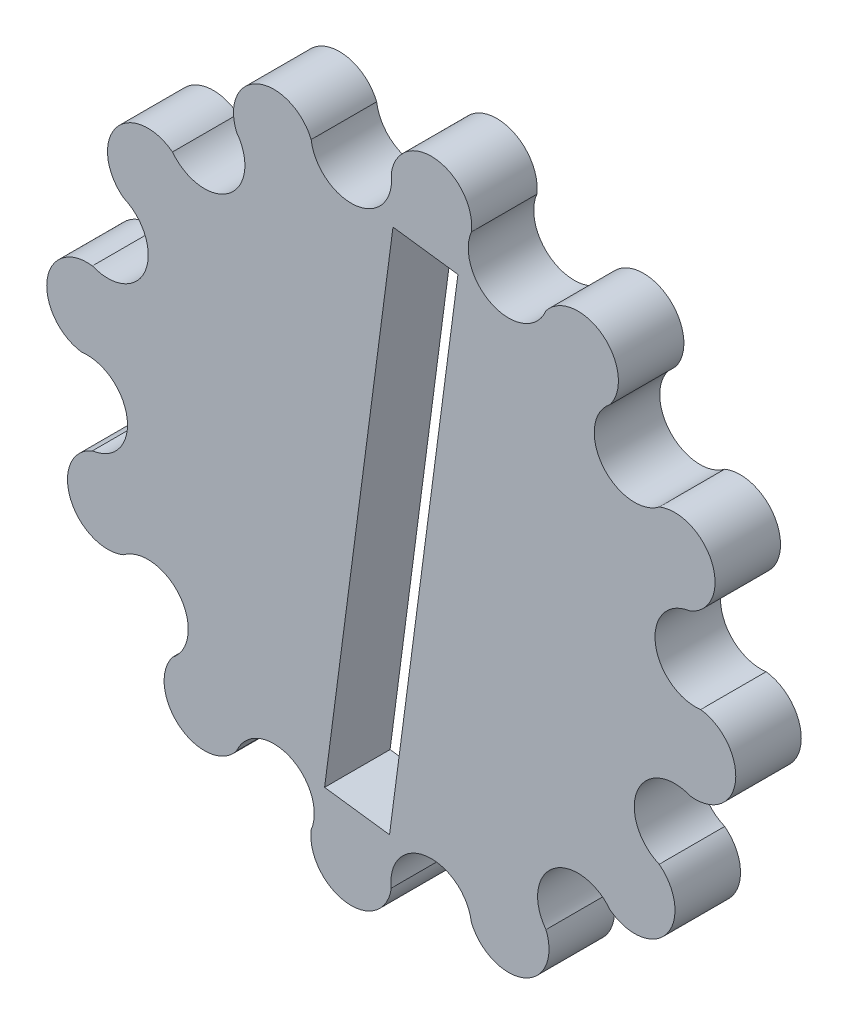
ISO-10303-21;
HEADER;
FILE_DESCRIPTION(('STEP AP214'),'2;1');
FILE_NAME('part.step','',(''),(''),'','','');
FILE_SCHEMA(('AUTOMOTIVE_DESIGN { 1 0 10303 214 1 1 1 1 }'));
ENDSEC;
DATA;
#1=APPLICATION_CONTEXT('core data for automotive mechanical design processes');
#2=APPLICATION_PROTOCOL_DEFINITION('international standard','automotive_design',2000,#1);
#3=PRODUCT_CONTEXT('',#1,'mechanical');
#4=PRODUCT('Part','Part','',(#3));
#5=PRODUCT_RELATED_PRODUCT_CATEGORY('part','',(#4));
#6=PRODUCT_DEFINITION_FORMATION('','',#4);
#7=PRODUCT_DEFINITION_CONTEXT('part definition',#1,'design');
#8=PRODUCT_DEFINITION('design','',#6,#7);
#9=PRODUCT_DEFINITION_SHAPE('','',#8);
#10=(LENGTH_UNIT() NAMED_UNIT(*) SI_UNIT(.MILLI.,.METRE.));
#11=(NAMED_UNIT(*) PLANE_ANGLE_UNIT() SI_UNIT($,.RADIAN.));
#12=(NAMED_UNIT(*) SI_UNIT($,.STERADIAN.) SOLID_ANGLE_UNIT());
#13=UNCERTAINTY_MEASURE_WITH_UNIT(LENGTH_MEASURE(1.E-05),#10,'distance_accuracy_value','');
#14=(GEOMETRIC_REPRESENTATION_CONTEXT(3) GLOBAL_UNCERTAINTY_ASSIGNED_CONTEXT((#13)) GLOBAL_UNIT_ASSIGNED_CONTEXT((#10,
#11,#12)) REPRESENTATION_CONTEXT('',''));
#15=CARTESIAN_POINT('',(0.,0.,0.));
#16=DIRECTION('',(0.,0.,1.));
#17=DIRECTION('',(1.,0.,0.));
#18=AXIS2_PLACEMENT_3D('',#15,#16,#17);
#19=CARTESIAN_POINT('',(-1.94114283826902,14.744443697168,3.175));
#20=DIRECTION('',(0.,0.,-1.));
#21=DIRECTION('',(-1.,0.,0.));
#22=AXIS2_PLACEMENT_3D('',#19,#20,#21);
#23=CYLINDRICAL_SURFACE('',#22,1.95789288330086);
#24=CARTESIAN_POINT('',(-1.94114283826902,14.744443697168,0.));
#25=DIRECTION('',(0.,0.,1.));
#26=DIRECTION('',(1.,0.,0.));
#27=AXIS2_PLACEMENT_3D('',#24,#25,#26);
#28=CIRCLE('',#27,1.95789288330086);
#29=CARTESIAN_POINT('',(-3.88228567653787,14.4888873943363,0.));
#30=VERTEX_POINT('',#29);
#31=CARTESIAN_POINT('',(0.,15.,0.));
#32=VERTEX_POINT('',#31);
#33=EDGE_CURVE('E250',#30,#32,#28,.T.);
#34=ORIENTED_EDGE('',*,*,#33,.F.);
#35=DIRECTION('',(0.,0.,-1.));
#36=VECTOR('',#35,1.);
#37=CARTESIAN_POINT('',(-3.88228567653787,14.4888873943363,3.175));
#38=LINE('',#37,#36);
#39=CARTESIAN_POINT('',(-3.88228567653787,14.4888873943363,3.175));
#40=VERTEX_POINT('',#39);
#41=EDGE_CURVE('E11',#40,#30,#38,.T.);
#42=ORIENTED_EDGE('',*,*,#41,.F.);
#43=CARTESIAN_POINT('',(-1.94114283826902,14.744443697168,3.175));
#44=DIRECTION('',(0.,0.,1.));
#45=DIRECTION('',(1.,0.,0.));
#46=AXIS2_PLACEMENT_3D('',#43,#44,#45);
#47=CIRCLE('',#46,1.95789288330086);
#48=CARTESIAN_POINT('',(0.,15.,3.175));
#49=VERTEX_POINT('',#48);
#50=EDGE_CURVE('E254',#40,#49,#47,.T.);
#51=ORIENTED_EDGE('',*,*,#50,.T.);
#52=DIRECTION('',(0.,0.,-1.));
#53=VECTOR('',#52,1.);
#54=CARTESIAN_POINT('',(0.,15.,3.175));
#55=LINE('',#54,#53);
#56=EDGE_CURVE('E327',#49,#32,#55,.T.);
#57=ORIENTED_EDGE('',*,*,#56,.T.);
#58=EDGE_LOOP('',(#34,#42,#51,#57));
#59=FACE_BOUND('',#58,.T.);
#60=ADVANCED_FACE('F36',(#59),#23,.F.);
#61=CARTESIAN_POINT('',(-5.69114283826919,13.7396342255516,3.175));
#62=DIRECTION('',(0.,0.,-1.));
#63=DIRECTION('',(-1.,0.,0.));
#64=AXIS2_PLACEMENT_3D('',#61,#62,#63);
#65=CYLINDRICAL_SURFACE('',#64,1.95789288330097);
#66=CARTESIAN_POINT('',(-5.69114283826919,13.7396342255516,0.));
#67=DIRECTION('',(0.,0.,1.));
#68=DIRECTION('',(1.,0.,0.));
#69=AXIS2_PLACEMENT_3D('',#66,#67,#68);
#70=CIRCLE('',#69,1.95789288330097);
#71=CARTESIAN_POINT('',(-7.50000000000024,12.9903810567662,0.));
#72=VERTEX_POINT('',#71);
#73=EDGE_CURVE('E330',#72,#30,#70,.F.);
#74=ORIENTED_EDGE('',*,*,#73,.F.);
#75=DIRECTION('',(0.,0.,-1.));
#76=VECTOR('',#75,1.);
#77=CARTESIAN_POINT('',(-7.50000000000024,12.9903810567662,3.175));
#78=LINE('',#77,#76);
#79=CARTESIAN_POINT('',(-7.50000000000024,12.9903810567662,3.175));
#80=VERTEX_POINT('',#79);
#81=EDGE_CURVE('E43',#80,#72,#78,.T.);
#82=ORIENTED_EDGE('',*,*,#81,.F.);
#83=CARTESIAN_POINT('',(-5.69114283826919,13.7396342255516,3.175));
#84=DIRECTION('',(0.,0.,1.));
#85=DIRECTION('',(1.,0.,0.));
#86=AXIS2_PLACEMENT_3D('',#83,#84,#85);
#87=CIRCLE('',#86,1.95789288330097);
#88=EDGE_CURVE('E257',#80,#40,#87,.F.);
#89=ORIENTED_EDGE('',*,*,#88,.T.);
#90=ORIENTED_EDGE('',*,*,#41,.T.);
#91=EDGE_LOOP('',(#74,#82,#89,#90));
#92=FACE_BOUND('',#91,.T.);
#93=ADVANCED_FACE('F447',(#92),#65,.T.);
#94=CARTESIAN_POINT('',(-9.0533008588994,11.7984913872822,3.175));
#95=DIRECTION('',(0.,0.,-1.));
#96=DIRECTION('',(-1.,0.,0.));
#97=AXIS2_PLACEMENT_3D('',#94,#95,#96);
#98=CYLINDRICAL_SURFACE('',#97,1.95789288330074);
#99=CARTESIAN_POINT('',(-9.0533008588994,11.7984913872822,0.));
#100=DIRECTION('',(0.,0.,1.));
#101=DIRECTION('',(1.,0.,0.));
#102=AXIS2_PLACEMENT_3D('',#99,#100,#101);
#103=CIRCLE('',#102,1.95789288330074);
#104=CARTESIAN_POINT('',(-10.6066017177988,10.6066017177981,0.));
#105=VERTEX_POINT('',#104);
#106=EDGE_CURVE('E333',#105,#72,#103,.T.);
#107=ORIENTED_EDGE('',*,*,#106,.F.);
#108=DIRECTION('',(0.,0.,-1.));
#109=VECTOR('',#108,1.);
#110=CARTESIAN_POINT('',(-10.6066017177988,10.6066017177981,3.175));
#111=LINE('',#110,#109);
#112=CARTESIAN_POINT('',(-10.6066017177988,10.6066017177981,3.175));
#113=VERTEX_POINT('',#112);
#114=EDGE_CURVE('E439',#113,#105,#111,.T.);
#115=ORIENTED_EDGE('',*,*,#114,.F.);
#116=CARTESIAN_POINT('',(-9.0533008588994,11.7984913872822,3.175));
#117=DIRECTION('',(0.,0.,1.));
#118=DIRECTION('',(1.,0.,0.));
#119=AXIS2_PLACEMENT_3D('',#116,#117,#118);
#120=CIRCLE('',#119,1.95789288330074);
#121=EDGE_CURVE('E261',#113,#80,#120,.T.);
#122=ORIENTED_EDGE('',*,*,#121,.T.);
#123=ORIENTED_EDGE('',*,*,#81,.T.);
#124=EDGE_LOOP('',(#107,#115,#122,#123));
#125=FACE_BOUND('',#124,.T.);
#126=ADVANCED_FACE('F443',(#125),#98,.F.);
#127=CARTESIAN_POINT('',(-11.7984913872827,9.05330085889871,3.175));
#128=DIRECTION('',(0.,0.,-1.));
#129=DIRECTION('',(-1.,0.,0.));
#130=AXIS2_PLACEMENT_3D('',#127,#128,#129);
#131=CYLINDRICAL_SURFACE('',#130,1.95789288330083);
#132=CARTESIAN_POINT('',(-11.7984913872827,9.05330085889871,0.));
#133=DIRECTION('',(0.,0.,1.));
#134=DIRECTION('',(1.,0.,0.));
#135=AXIS2_PLACEMENT_3D('',#132,#133,#134);
#136=CIRCLE('',#135,1.95789288330083);
#137=CARTESIAN_POINT('',(-12.9903810567669,7.49999999999959,0.));
#138=VERTEX_POINT('',#137);
#139=EDGE_CURVE('E336',#138,#105,#136,.F.);
#140=ORIENTED_EDGE('',*,*,#139,.F.);
#141=DIRECTION('',(0.,0.,-1.));
#142=VECTOR('',#141,1.);
#143=CARTESIAN_POINT('',(-12.9903810567669,7.49999999999959,3.175));
#144=LINE('',#143,#142);
#145=CARTESIAN_POINT('',(-12.9903810567669,7.49999999999959,3.175));
#146=VERTEX_POINT('',#145);
#147=EDGE_CURVE('E437',#146,#138,#144,.T.);
#148=ORIENTED_EDGE('',*,*,#147,.F.);
#149=CARTESIAN_POINT('',(-11.7984913872827,9.05330085889871,3.175));
#150=DIRECTION('',(0.,0.,1.));
#151=DIRECTION('',(1.,0.,0.));
#152=AXIS2_PLACEMENT_3D('',#149,#150,#151);
#153=CIRCLE('',#152,1.95789288330083);
#154=EDGE_CURVE('E264',#146,#113,#153,.F.);
#155=ORIENTED_EDGE('',*,*,#154,.T.);
#156=ORIENTED_EDGE('',*,*,#114,.T.);
#157=EDGE_LOOP('',(#140,#148,#155,#156));
#158=FACE_BOUND('',#157,.T.);
#159=ADVANCED_FACE('F454',(#158),#131,.T.);
#160=CARTESIAN_POINT('',(-13.7396342255516,5.69114283826829,3.175));
#161=DIRECTION('',(0.,0.,-1.));
#162=DIRECTION('',(-1.,0.,0.));
#163=AXIS2_PLACEMENT_3D('',#160,#161,#162);
#164=CYLINDRICAL_SURFACE('',#163,1.95789288330093);
#165=CARTESIAN_POINT('',(-13.7396342255516,5.69114283826829,0.));
#166=DIRECTION('',(0.,0.,1.));
#167=DIRECTION('',(1.,0.,0.));
#168=AXIS2_PLACEMENT_3D('',#165,#166,#167);
#169=CIRCLE('',#168,1.95789288330093);
#170=CARTESIAN_POINT('',(-14.4888873943364,3.88228567653716,0.));
#171=VERTEX_POINT('',#170);
#172=EDGE_CURVE('E339',#171,#138,#169,.T.);
#173=ORIENTED_EDGE('',*,*,#172,.F.);
#174=DIRECTION('',(0.,0.,-1.));
#175=VECTOR('',#174,1.);
#176=CARTESIAN_POINT('',(-14.4888873943364,3.88228567653716,3.175));
#177=LINE('',#176,#175);
#178=CARTESIAN_POINT('',(-14.4888873943364,3.88228567653716,3.175));
#179=VERTEX_POINT('',#178);
#180=EDGE_CURVE('E435',#179,#171,#177,.T.);
#181=ORIENTED_EDGE('',*,*,#180,.F.);
#182=CARTESIAN_POINT('',(-13.7396342255516,5.69114283826829,3.175));
#183=DIRECTION('',(0.,0.,1.));
#184=DIRECTION('',(1.,0.,0.));
#185=AXIS2_PLACEMENT_3D('',#182,#183,#184);
#186=CIRCLE('',#185,1.95789288330093);
#187=EDGE_CURVE('E267',#179,#146,#186,.T.);
#188=ORIENTED_EDGE('',*,*,#187,.T.);
#189=ORIENTED_EDGE('',*,*,#147,.T.);
#190=EDGE_LOOP('',(#173,#181,#188,#189));
#191=FACE_BOUND('',#190,.T.);
#192=ADVANCED_FACE('F536',(#191),#164,.F.);
#193=CARTESIAN_POINT('',(-14.7444436971682,1.94114283826815,3.175));
#194=DIRECTION('',(0.,0.,-1.));
#195=DIRECTION('',(-1.,0.,0.));
#196=AXIS2_PLACEMENT_3D('',#193,#194,#195);
#197=CYLINDRICAL_SURFACE('',#196,1.95789288330085);
#198=CARTESIAN_POINT('',(-14.7444436971682,1.94114283826815,0.));
#199=DIRECTION('',(0.,0.,1.));
#200=DIRECTION('',(1.,0.,0.));
#201=AXIS2_PLACEMENT_3D('',#198,#199,#200);
#202=CIRCLE('',#201,1.95789288330085);
#203=CARTESIAN_POINT('',(-15.,-8.5413447148408E-13,0.));
#204=VERTEX_POINT('',#203);
#205=EDGE_CURVE('E342',#204,#171,#202,.F.);
#206=ORIENTED_EDGE('',*,*,#205,.F.);
#207=DIRECTION('',(0.,0.,-1.));
#208=VECTOR('',#207,1.);
#209=CARTESIAN_POINT('',(-15.,-8.5413447148408E-13,3.175));
#210=LINE('',#209,#208);
#211=CARTESIAN_POINT('',(-15.,-8.5413447148408E-13,3.175));
#212=VERTEX_POINT('',#211);
#213=EDGE_CURVE('E433',#212,#204,#210,.T.);
#214=ORIENTED_EDGE('',*,*,#213,.F.);
#215=CARTESIAN_POINT('',(-14.7444436971682,1.94114283826815,3.175));
#216=DIRECTION('',(0.,0.,1.));
#217=DIRECTION('',(1.,0.,0.));
#218=AXIS2_PLACEMENT_3D('',#215,#216,#217);
#219=CIRCLE('',#218,1.95789288330085);
#220=EDGE_CURVE('E270',#212,#179,#219,.F.);
#221=ORIENTED_EDGE('',*,*,#220,.T.);
#222=ORIENTED_EDGE('',*,*,#180,.T.);
#223=EDGE_LOOP('',(#206,#214,#221,#222));
#224=FACE_BOUND('',#223,.T.);
#225=ADVANCED_FACE('F534',(#224),#197,.T.);
#226=CARTESIAN_POINT('',(-14.7444436971681,-1.94114283826985,3.175));
#227=DIRECTION('',(0.,0.,-1.));
#228=DIRECTION('',(-1.,0.,0.));
#229=AXIS2_PLACEMENT_3D('',#226,#227,#228);
#230=CYLINDRICAL_SURFACE('',#229,1.95789288330085);
#231=CARTESIAN_POINT('',(-14.7444436971681,-1.94114283826985,0.));
#232=DIRECTION('',(0.,0.,1.));
#233=DIRECTION('',(1.,0.,0.));
#234=AXIS2_PLACEMENT_3D('',#231,#232,#233);
#235=CIRCLE('',#234,1.95789288330085);
#236=CARTESIAN_POINT('',(-14.4888873943362,-3.88228567653885,0.));
#237=VERTEX_POINT('',#236);
#238=EDGE_CURVE('E345',#237,#204,#235,.T.);
#239=ORIENTED_EDGE('',*,*,#238,.F.);
#240=DIRECTION('',(0.,0.,-1.));
#241=VECTOR('',#240,1.);
#242=CARTESIAN_POINT('',(-14.4888873943362,-3.88228567653885,3.175));
#243=LINE('',#242,#241);
#244=CARTESIAN_POINT('',(-14.4888873943362,-3.88228567653885,3.175));
#245=VERTEX_POINT('',#244);
#246=EDGE_CURVE('E431',#245,#237,#243,.T.);
#247=ORIENTED_EDGE('',*,*,#246,.F.);
#248=CARTESIAN_POINT('',(-14.7444436971681,-1.94114283826985,3.175));
#249=DIRECTION('',(0.,0.,1.));
#250=DIRECTION('',(1.,0.,0.));
#251=AXIS2_PLACEMENT_3D('',#248,#249,#250);
#252=CIRCLE('',#251,1.95789288330085);
#253=EDGE_CURVE('E273',#245,#212,#252,.T.);
#254=ORIENTED_EDGE('',*,*,#253,.T.);
#255=ORIENTED_EDGE('',*,*,#213,.T.);
#256=EDGE_LOOP('',(#239,#247,#254,#255));
#257=FACE_BOUND('',#256,.T.);
#258=ADVANCED_FACE('F530',(#257),#230,.F.);
#259=CARTESIAN_POINT('',(-13.7396342255513,-5.69114283826993,3.175));
#260=DIRECTION('',(0.,0.,-1.));
#261=DIRECTION('',(-1.,0.,0.));
#262=AXIS2_PLACEMENT_3D('',#259,#260,#261);
#263=CYLINDRICAL_SURFACE('',#262,1.95789288330085);
#264=CARTESIAN_POINT('',(-13.7396342255513,-5.69114283826993,0.));
#265=DIRECTION('',(0.,0.,1.));
#266=DIRECTION('',(1.,0.,0.));
#267=AXIS2_PLACEMENT_3D('',#264,#265,#266);
#268=CIRCLE('',#267,1.95789288330085);
#269=CARTESIAN_POINT('',(-12.9903810567663,-7.50000000000101,0.));
#270=VERTEX_POINT('',#269);
#271=EDGE_CURVE('E348',#270,#237,#268,.F.);
#272=ORIENTED_EDGE('',*,*,#271,.F.);
#273=DIRECTION('',(0.,0.,-1.));
#274=VECTOR('',#273,1.);
#275=CARTESIAN_POINT('',(-12.9903810567663,-7.50000000000101,3.175));
#276=LINE('',#275,#274);
#277=CARTESIAN_POINT('',(-12.9903810567663,-7.50000000000101,3.175));
#278=VERTEX_POINT('',#277);
#279=EDGE_CURVE('E429',#278,#270,#276,.T.);
#280=ORIENTED_EDGE('',*,*,#279,.F.);
#281=CARTESIAN_POINT('',(-13.7396342255513,-5.69114283826993,3.175));
#282=DIRECTION('',(0.,0.,1.));
#283=DIRECTION('',(1.,0.,0.));
#284=AXIS2_PLACEMENT_3D('',#281,#282,#283);
#285=CIRCLE('',#284,1.95789288330085);
#286=EDGE_CURVE('E276',#278,#245,#285,.F.);
#287=ORIENTED_EDGE('',*,*,#286,.T.);
#288=ORIENTED_EDGE('',*,*,#246,.T.);
#289=EDGE_LOOP('',(#272,#280,#287,#288));
#290=FACE_BOUND('',#289,.T.);
#291=ADVANCED_FACE('F526',(#290),#263,.T.);
#292=CARTESIAN_POINT('',(-11.7984913872822,-9.05330085890024,3.175));
#293=DIRECTION('',(0.,0.,-1.));
#294=DIRECTION('',(-1.,0.,0.));
#295=AXIS2_PLACEMENT_3D('',#292,#293,#294);
#296=CYLINDRICAL_SURFACE('',#295,1.95789288330085);
#297=CARTESIAN_POINT('',(-11.7984913872822,-9.05330085890024,0.));
#298=DIRECTION('',(0.,0.,1.));
#299=DIRECTION('',(1.,0.,0.));
#300=AXIS2_PLACEMENT_3D('',#297,#298,#299);
#301=CIRCLE('',#300,1.95789288330085);
#302=CARTESIAN_POINT('',(-10.606601717798,-10.6066017177995,0.));
#303=VERTEX_POINT('',#302);
#304=EDGE_CURVE('E351',#303,#270,#301,.T.);
#305=ORIENTED_EDGE('',*,*,#304,.F.);
#306=DIRECTION('',(0.,0.,-1.));
#307=VECTOR('',#306,1.);
#308=CARTESIAN_POINT('',(-10.606601717798,-10.6066017177995,3.175));
#309=LINE('',#308,#307);
#310=CARTESIAN_POINT('',(-10.606601717798,-10.6066017177995,3.175));
#311=VERTEX_POINT('',#310);
#312=EDGE_CURVE('E427',#311,#303,#309,.T.);
#313=ORIENTED_EDGE('',*,*,#312,.F.);
#314=CARTESIAN_POINT('',(-11.7984913872822,-9.05330085890024,3.175));
#315=DIRECTION('',(0.,0.,1.));
#316=DIRECTION('',(1.,0.,0.));
#317=AXIS2_PLACEMENT_3D('',#314,#315,#316);
#318=CIRCLE('',#317,1.95789288330085);
#319=EDGE_CURVE('E279',#311,#278,#318,.T.);
#320=ORIENTED_EDGE('',*,*,#319,.T.);
#321=ORIENTED_EDGE('',*,*,#279,.T.);
#322=EDGE_LOOP('',(#305,#313,#320,#321));
#323=FACE_BOUND('',#322,.T.);
#324=ADVANCED_FACE('F522',(#323),#296,.F.);
#325=CARTESIAN_POINT('',(-9.05330085889871,-11.7984913872835,3.175));
#326=DIRECTION('',(0.,0.,-1.));
#327=DIRECTION('',(-1.,0.,0.));
#328=AXIS2_PLACEMENT_3D('',#325,#326,#327);
#329=CYLINDRICAL_SURFACE('',#328,1.95789288330085);
#330=CARTESIAN_POINT('',(-9.05330085889871,-11.7984913872835,0.));
#331=DIRECTION('',(0.,0.,1.));
#332=DIRECTION('',(1.,0.,0.));
#333=AXIS2_PLACEMENT_3D('',#330,#331,#332);
#334=CIRCLE('',#333,1.95789288330085);
#335=CARTESIAN_POINT('',(-7.49999999999942,-12.9903810567676,0.));
#336=VERTEX_POINT('',#335);
#337=EDGE_CURVE('E354',#336,#303,#334,.F.);
#338=ORIENTED_EDGE('',*,*,#337,.F.);
#339=DIRECTION('',(0.,0.,-1.));
#340=VECTOR('',#339,1.);
#341=CARTESIAN_POINT('',(-7.49999999999942,-12.9903810567676,3.175));
#342=LINE('',#341,#340);
#343=CARTESIAN_POINT('',(-7.49999999999942,-12.9903810567676,3.175));
#344=VERTEX_POINT('',#343);
#345=EDGE_CURVE('E425',#344,#336,#342,.T.);
#346=ORIENTED_EDGE('',*,*,#345,.F.);
#347=CARTESIAN_POINT('',(-9.05330085889871,-11.7984913872835,3.175));
#348=DIRECTION('',(0.,0.,1.));
#349=DIRECTION('',(1.,0.,0.));
#350=AXIS2_PLACEMENT_3D('',#347,#348,#349);
#351=CIRCLE('',#350,1.95789288330085);
#352=EDGE_CURVE('E282',#344,#311,#351,.F.);
#353=ORIENTED_EDGE('',*,*,#352,.T.);
#354=ORIENTED_EDGE('',*,*,#312,.T.);
#355=EDGE_LOOP('',(#338,#346,#353,#354));
#356=FACE_BOUND('',#355,.T.);
#357=ADVANCED_FACE('F518',(#356),#329,.T.);
#358=CARTESIAN_POINT('',(-5.6911428382683,-13.7396342255524,3.175));
#359=DIRECTION('',(0.,0.,-1.));
#360=DIRECTION('',(-1.,0.,0.));
#361=AXIS2_PLACEMENT_3D('',#358,#359,#360);
#362=CYLINDRICAL_SURFACE('',#361,1.95789288330085);
#363=CARTESIAN_POINT('',(-5.6911428382683,-13.7396342255524,0.));
#364=DIRECTION('',(0.,0.,1.));
#365=DIRECTION('',(1.,0.,0.));
#366=AXIS2_PLACEMENT_3D('',#363,#364,#365);
#367=CIRCLE('',#366,1.95789288330085);
#368=CARTESIAN_POINT('',(-3.88228567653717,-14.4888873943373,0.));
#369=VERTEX_POINT('',#368);
#370=EDGE_CURVE('E357',#369,#336,#367,.T.);
#371=ORIENTED_EDGE('',*,*,#370,.F.);
#372=DIRECTION('',(0.,0.,-1.));
#373=VECTOR('',#372,1.);
#374=CARTESIAN_POINT('',(-3.88228567653717,-14.4888873943373,3.175));
#375=LINE('',#374,#373);
#376=CARTESIAN_POINT('',(-3.88228567653717,-14.4888873943373,3.175));
#377=VERTEX_POINT('',#376);
#378=EDGE_CURVE('E423',#377,#369,#375,.T.);
#379=ORIENTED_EDGE('',*,*,#378,.F.);
#380=CARTESIAN_POINT('',(-5.6911428382683,-13.7396342255524,3.175));
#381=DIRECTION('',(0.,0.,1.));
#382=DIRECTION('',(1.,0.,0.));
#383=AXIS2_PLACEMENT_3D('',#380,#381,#382);
#384=CIRCLE('',#383,1.95789288330085);
#385=EDGE_CURVE('E285',#377,#344,#384,.T.);
#386=ORIENTED_EDGE('',*,*,#385,.T.);
#387=ORIENTED_EDGE('',*,*,#345,.T.);
#388=EDGE_LOOP('',(#371,#379,#386,#387));
#389=FACE_BOUND('',#388,.T.);
#390=ADVANCED_FACE('F514',(#389),#362,.F.);
#391=CARTESIAN_POINT('',(-1.94114283826816,-14.7444436971691,3.175));
#392=DIRECTION('',(0.,0.,-1.));
#393=DIRECTION('',(-1.,0.,0.));
#394=AXIS2_PLACEMENT_3D('',#391,#392,#393);
#395=CYLINDRICAL_SURFACE('',#394,1.95789288330085);
#396=CARTESIAN_POINT('',(-1.94114283826816,-14.7444436971691,0.));
#397=DIRECTION('',(0.,0.,1.));
#398=DIRECTION('',(1.,0.,0.));
#399=AXIS2_PLACEMENT_3D('',#396,#397,#398);
#400=CIRCLE('',#399,1.95789288330085);
#401=CARTESIAN_POINT('',(8.50881864966624E-13,-15.0000000000009,0.));
#402=VERTEX_POINT('',#401);
#403=EDGE_CURVE('E360',#402,#369,#400,.F.);
#404=ORIENTED_EDGE('',*,*,#403,.F.);
#405=DIRECTION('',(0.,0.,-1.));
#406=VECTOR('',#405,1.);
#407=CARTESIAN_POINT('',(8.50881864966624E-13,-15.0000000000009,3.175));
#408=LINE('',#407,#406);
#409=CARTESIAN_POINT('',(8.50881864966624E-13,-15.0000000000009,3.175));
#410=VERTEX_POINT('',#409);
#411=EDGE_CURVE('E421',#410,#402,#408,.T.);
#412=ORIENTED_EDGE('',*,*,#411,.F.);
#413=CARTESIAN_POINT('',(-1.94114283826816,-14.7444436971691,3.175));
#414=DIRECTION('',(0.,0.,1.));
#415=DIRECTION('',(1.,0.,0.));
#416=AXIS2_PLACEMENT_3D('',#413,#414,#415);
#417=CIRCLE('',#416,1.95789288330085);
#418=EDGE_CURVE('E288',#410,#377,#417,.F.);
#419=ORIENTED_EDGE('',*,*,#418,.T.);
#420=ORIENTED_EDGE('',*,*,#378,.T.);
#421=EDGE_LOOP('',(#404,#412,#419,#420));
#422=FACE_BOUND('',#421,.T.);
#423=ADVANCED_FACE('F510',(#422),#395,.T.);
#424=CARTESIAN_POINT('',(1.94114283826985,-14.744443697169,3.175));
#425=DIRECTION('',(0.,0.,-1.));
#426=DIRECTION('',(-1.,0.,0.));
#427=AXIS2_PLACEMENT_3D('',#424,#425,#426);
#428=CYLINDRICAL_SURFACE('',#427,1.95789288330085);
#429=CARTESIAN_POINT('',(1.94114283826985,-14.744443697169,0.));
#430=DIRECTION('',(0.,0.,1.));
#431=DIRECTION('',(1.,0.,0.));
#432=AXIS2_PLACEMENT_3D('',#429,#430,#431);
#433=CIRCLE('',#432,1.95789288330085);
#434=CARTESIAN_POINT('',(3.88228567653885,-14.4888873943371,0.));
#435=VERTEX_POINT('',#434);
#436=EDGE_CURVE('E363',#435,#402,#433,.T.);
#437=ORIENTED_EDGE('',*,*,#436,.F.);
#438=DIRECTION('',(0.,0.,-1.));
#439=VECTOR('',#438,1.);
#440=CARTESIAN_POINT('',(3.88228567653885,-14.4888873943371,3.175));
#441=LINE('',#440,#439);
#442=CARTESIAN_POINT('',(3.88228567653885,-14.4888873943371,3.175));
#443=VERTEX_POINT('',#442);
#444=EDGE_CURVE('E419',#443,#435,#441,.T.);
#445=ORIENTED_EDGE('',*,*,#444,.F.);
#446=CARTESIAN_POINT('',(1.94114283826985,-14.744443697169,3.175));
#447=DIRECTION('',(0.,0.,1.));
#448=DIRECTION('',(1.,0.,0.));
#449=AXIS2_PLACEMENT_3D('',#446,#447,#448);
#450=CIRCLE('',#449,1.95789288330085);
#451=EDGE_CURVE('E291',#443,#410,#450,.T.);
#452=ORIENTED_EDGE('',*,*,#451,.T.);
#453=ORIENTED_EDGE('',*,*,#411,.T.);
#454=EDGE_LOOP('',(#437,#445,#452,#453));
#455=FACE_BOUND('',#454,.T.);
#456=ADVANCED_FACE('F506',(#455),#428,.F.);
#457=CARTESIAN_POINT('',(5.69114283826993,-13.7396342255521,3.175));
#458=DIRECTION('',(0.,0.,-1.));
#459=DIRECTION('',(-1.,0.,0.));
#460=AXIS2_PLACEMENT_3D('',#457,#458,#459);
#461=CYLINDRICAL_SURFACE('',#460,1.95789288330085);
#462=CARTESIAN_POINT('',(5.69114283826993,-13.7396342255521,0.));
#463=DIRECTION('',(0.,0.,1.));
#464=DIRECTION('',(1.,0.,0.));
#465=AXIS2_PLACEMENT_3D('',#462,#463,#464);
#466=CIRCLE('',#465,1.95789288330085);
#467=CARTESIAN_POINT('',(7.50000000000101,-12.9903810567672,0.));
#468=VERTEX_POINT('',#467);
#469=EDGE_CURVE('E366',#468,#435,#466,.F.);
#470=ORIENTED_EDGE('',*,*,#469,.F.);
#471=DIRECTION('',(0.,0.,-1.));
#472=VECTOR('',#471,1.);
#473=CARTESIAN_POINT('',(7.50000000000101,-12.9903810567672,3.175));
#474=LINE('',#473,#472);
#475=CARTESIAN_POINT('',(7.50000000000101,-12.9903810567672,3.175));
#476=VERTEX_POINT('',#475);
#477=EDGE_CURVE('E417',#476,#468,#474,.T.);
#478=ORIENTED_EDGE('',*,*,#477,.F.);
#479=CARTESIAN_POINT('',(5.69114283826993,-13.7396342255521,3.175));
#480=DIRECTION('',(0.,0.,1.));
#481=DIRECTION('',(1.,0.,0.));
#482=AXIS2_PLACEMENT_3D('',#479,#480,#481);
#483=CIRCLE('',#482,1.95789288330085);
#484=EDGE_CURVE('E294',#476,#443,#483,.F.);
#485=ORIENTED_EDGE('',*,*,#484,.T.);
#486=ORIENTED_EDGE('',*,*,#444,.T.);
#487=EDGE_LOOP('',(#470,#478,#485,#486));
#488=FACE_BOUND('',#487,.T.);
#489=ADVANCED_FACE('F502',(#488),#461,.T.);
#490=CARTESIAN_POINT('',(9.05330085890024,-11.798491387283,3.175));
#491=DIRECTION('',(0.,0.,-1.));
#492=DIRECTION('',(-1.,0.,0.));
#493=AXIS2_PLACEMENT_3D('',#490,#491,#492);
#494=CYLINDRICAL_SURFACE('',#493,1.95789288330085);
#495=CARTESIAN_POINT('',(9.05330085890024,-11.798491387283,0.));
#496=DIRECTION('',(0.,0.,1.));
#497=DIRECTION('',(1.,0.,0.));
#498=AXIS2_PLACEMENT_3D('',#495,#496,#497);
#499=CIRCLE('',#498,1.95789288330085);
#500=CARTESIAN_POINT('',(10.6066017177995,-10.6066017177989,0.));
#501=VERTEX_POINT('',#500);
#502=EDGE_CURVE('E369',#501,#468,#499,.T.);
#503=ORIENTED_EDGE('',*,*,#502,.F.);
#504=DIRECTION('',(0.,0.,-1.));
#505=VECTOR('',#504,1.);
#506=CARTESIAN_POINT('',(10.6066017177995,-10.6066017177989,3.175));
#507=LINE('',#506,#505);
#508=CARTESIAN_POINT('',(10.6066017177995,-10.6066017177989,3.175));
#509=VERTEX_POINT('',#508);
#510=EDGE_CURVE('E415',#509,#501,#507,.T.);
#511=ORIENTED_EDGE('',*,*,#510,.F.);
#512=CARTESIAN_POINT('',(9.05330085890024,-11.798491387283,3.175));
#513=DIRECTION('',(0.,0.,1.));
#514=DIRECTION('',(1.,0.,0.));
#515=AXIS2_PLACEMENT_3D('',#512,#513,#514);
#516=CIRCLE('',#515,1.95789288330085);
#517=EDGE_CURVE('E297',#509,#476,#516,.T.);
#518=ORIENTED_EDGE('',*,*,#517,.T.);
#519=ORIENTED_EDGE('',*,*,#477,.T.);
#520=EDGE_LOOP('',(#503,#511,#518,#519));
#521=FACE_BOUND('',#520,.T.);
#522=ADVANCED_FACE('F498',(#521),#494,.F.);
#523=CARTESIAN_POINT('',(11.7984913872835,-9.05330085889957,3.175));
#524=DIRECTION('',(0.,0.,-1.));
#525=DIRECTION('',(-1.,0.,0.));
#526=AXIS2_PLACEMENT_3D('',#523,#524,#525);
#527=CYLINDRICAL_SURFACE('',#526,1.95789288330085);
#528=CARTESIAN_POINT('',(11.7984913872835,-9.05330085889957,0.));
#529=DIRECTION('',(0.,0.,1.));
#530=DIRECTION('',(1.,0.,0.));
#531=AXIS2_PLACEMENT_3D('',#528,#529,#530);
#532=CIRCLE('',#531,1.95789288330085);
#533=CARTESIAN_POINT('',(12.9903810567676,-7.50000000000027,0.));
#534=VERTEX_POINT('',#533);
#535=EDGE_CURVE('E372',#534,#501,#532,.F.);
#536=ORIENTED_EDGE('',*,*,#535,.F.);
#537=DIRECTION('',(0.,0.,-1.));
#538=VECTOR('',#537,1.);
#539=CARTESIAN_POINT('',(12.9903810567676,-7.50000000000027,3.175));
#540=LINE('',#539,#538);
#541=CARTESIAN_POINT('',(12.9903810567676,-7.50000000000027,3.175));
#542=VERTEX_POINT('',#541);
#543=EDGE_CURVE('E413',#542,#534,#540,.T.);
#544=ORIENTED_EDGE('',*,*,#543,.F.);
#545=CARTESIAN_POINT('',(11.7984913872835,-9.05330085889957,3.175));
#546=DIRECTION('',(0.,0.,1.));
#547=DIRECTION('',(1.,0.,0.));
#548=AXIS2_PLACEMENT_3D('',#545,#546,#547);
#549=CIRCLE('',#548,1.95789288330085);
#550=EDGE_CURVE('E300',#542,#509,#549,.F.);
#551=ORIENTED_EDGE('',*,*,#550,.T.);
#552=ORIENTED_EDGE('',*,*,#510,.T.);
#553=EDGE_LOOP('',(#536,#544,#551,#552));
#554=FACE_BOUND('',#553,.T.);
#555=ADVANCED_FACE('F494',(#554),#527,.T.);
#556=CARTESIAN_POINT('',(13.7396342255524,-5.69114283826915,3.175));
#557=DIRECTION('',(0.,0.,-1.));
#558=DIRECTION('',(-1.,0.,0.));
#559=AXIS2_PLACEMENT_3D('',#556,#557,#558);
#560=CYLINDRICAL_SURFACE('',#559,1.95789288330085);
#561=CARTESIAN_POINT('',(13.7396342255524,-5.69114283826915,0.));
#562=DIRECTION('',(0.,0.,1.));
#563=DIRECTION('',(1.,0.,0.));
#564=AXIS2_PLACEMENT_3D('',#561,#562,#563);
#565=CIRCLE('',#564,1.95789288330085);
#566=CARTESIAN_POINT('',(14.4888873943373,-3.88228567653802,0.));
#567=VERTEX_POINT('',#566);
#568=EDGE_CURVE('E375',#567,#534,#565,.T.);
#569=ORIENTED_EDGE('',*,*,#568,.F.);
#570=DIRECTION('',(0.,0.,-1.));
#571=VECTOR('',#570,1.);
#572=CARTESIAN_POINT('',(14.4888873943373,-3.88228567653802,3.175));
#573=LINE('',#572,#571);
#574=CARTESIAN_POINT('',(14.4888873943373,-3.88228567653802,3.175));
#575=VERTEX_POINT('',#574);
#576=EDGE_CURVE('E411',#575,#567,#573,.T.);
#577=ORIENTED_EDGE('',*,*,#576,.F.);
#578=CARTESIAN_POINT('',(13.7396342255524,-5.69114283826915,3.175));
#579=DIRECTION('',(0.,0.,1.));
#580=DIRECTION('',(1.,0.,0.));
#581=AXIS2_PLACEMENT_3D('',#578,#579,#580);
#582=CIRCLE('',#581,1.95789288330085);
#583=EDGE_CURVE('E303',#575,#542,#582,.T.);
#584=ORIENTED_EDGE('',*,*,#583,.T.);
#585=ORIENTED_EDGE('',*,*,#543,.T.);
#586=EDGE_LOOP('',(#569,#577,#584,#585));
#587=FACE_BOUND('',#586,.T.);
#588=ADVANCED_FACE('F490',(#587),#560,.F.);
#589=CARTESIAN_POINT('',(14.7444436971691,-1.94114283826901,3.175));
#590=DIRECTION('',(0.,0.,-1.));
#591=DIRECTION('',(-1.,0.,0.));
#592=AXIS2_PLACEMENT_3D('',#589,#590,#591);
#593=CYLINDRICAL_SURFACE('',#592,1.95789288330085);
#594=CARTESIAN_POINT('',(14.7444436971691,-1.94114283826901,0.));
#595=DIRECTION('',(0.,0.,1.));
#596=DIRECTION('',(1.,0.,0.));
#597=AXIS2_PLACEMENT_3D('',#594,#595,#596);
#598=CIRCLE('',#597,1.95789288330085);
#599=CARTESIAN_POINT('',(15.0000000000009,0.,0.));
#600=VERTEX_POINT('',#599);
#601=EDGE_CURVE('E378',#600,#567,#598,.F.);
#602=ORIENTED_EDGE('',*,*,#601,.F.);
#603=DIRECTION('',(0.,0.,-1.));
#604=VECTOR('',#603,1.);
#605=CARTESIAN_POINT('',(15.0000000000009,0.,3.175));
#606=LINE('',#605,#604);
#607=CARTESIAN_POINT('',(15.0000000000009,0.,3.175));
#608=VERTEX_POINT('',#607);
#609=EDGE_CURVE('E409',#608,#600,#606,.T.);
#610=ORIENTED_EDGE('',*,*,#609,.F.);
#611=CARTESIAN_POINT('',(14.7444436971691,-1.94114283826901,3.175));
#612=DIRECTION('',(0.,0.,1.));
#613=DIRECTION('',(1.,0.,0.));
#614=AXIS2_PLACEMENT_3D('',#611,#612,#613);
#615=CIRCLE('',#614,1.95789288330085);
#616=EDGE_CURVE('E306',#608,#575,#615,.F.);
#617=ORIENTED_EDGE('',*,*,#616,.T.);
#618=ORIENTED_EDGE('',*,*,#576,.T.);
#619=EDGE_LOOP('',(#602,#610,#617,#618));
#620=FACE_BOUND('',#619,.T.);
#621=ADVANCED_FACE('F486',(#620),#593,.T.);
#622=CARTESIAN_POINT('',(14.744443697169,1.94114283826899,3.175));
#623=DIRECTION('',(0.,0.,-1.));
#624=DIRECTION('',(-1.,0.,0.));
#625=AXIS2_PLACEMENT_3D('',#622,#623,#624);
#626=CYLINDRICAL_SURFACE('',#625,1.95789288330085);
#627=CARTESIAN_POINT('',(14.744443697169,1.94114283826899,0.));
#628=DIRECTION('',(0.,0.,1.));
#629=DIRECTION('',(1.,0.,0.));
#630=AXIS2_PLACEMENT_3D('',#627,#628,#629);
#631=CIRCLE('',#630,1.95789288330085);
#632=CARTESIAN_POINT('',(14.4888873943371,3.88228567653799,0.));
#633=VERTEX_POINT('',#632);
#634=EDGE_CURVE('E381',#633,#600,#631,.T.);
#635=ORIENTED_EDGE('',*,*,#634,.F.);
#636=DIRECTION('',(0.,0.,-1.));
#637=VECTOR('',#636,1.);
#638=CARTESIAN_POINT('',(14.4888873943371,3.88228567653799,3.175));
#639=LINE('',#638,#637);
#640=CARTESIAN_POINT('',(14.4888873943371,3.88228567653799,3.175));
#641=VERTEX_POINT('',#640);
#642=EDGE_CURVE('E407',#641,#633,#639,.T.);
#643=ORIENTED_EDGE('',*,*,#642,.F.);
#644=CARTESIAN_POINT('',(14.744443697169,1.94114283826899,3.175));
#645=DIRECTION('',(0.,0.,1.));
#646=DIRECTION('',(1.,0.,0.));
#647=AXIS2_PLACEMENT_3D('',#644,#645,#646);
#648=CIRCLE('',#647,1.95789288330085);
#649=EDGE_CURVE('E309',#641,#608,#648,.T.);
#650=ORIENTED_EDGE('',*,*,#649,.T.);
#651=ORIENTED_EDGE('',*,*,#609,.T.);
#652=EDGE_LOOP('',(#635,#643,#650,#651));
#653=FACE_BOUND('',#652,.T.);
#654=ADVANCED_FACE('F482',(#653),#626,.F.);
#655=CARTESIAN_POINT('',(13.7396342255521,5.69114283826907,3.175));
#656=DIRECTION('',(0.,0.,-1.));
#657=DIRECTION('',(-1.,0.,0.));
#658=AXIS2_PLACEMENT_3D('',#655,#656,#657);
#659=CYLINDRICAL_SURFACE('',#658,1.95789288330085);
#660=CARTESIAN_POINT('',(13.7396342255521,5.69114283826907,0.));
#661=DIRECTION('',(0.,0.,1.));
#662=DIRECTION('',(1.,0.,0.));
#663=AXIS2_PLACEMENT_3D('',#660,#661,#662);
#664=CIRCLE('',#663,1.95789288330085);
#665=CARTESIAN_POINT('',(12.9903810567672,7.50000000000015,0.));
#666=VERTEX_POINT('',#665);
#667=EDGE_CURVE('E384',#666,#633,#664,.F.);
#668=ORIENTED_EDGE('',*,*,#667,.F.);
#669=DIRECTION('',(0.,0.,-1.));
#670=VECTOR('',#669,1.);
#671=CARTESIAN_POINT('',(12.9903810567672,7.50000000000015,3.175));
#672=LINE('',#671,#670);
#673=CARTESIAN_POINT('',(12.9903810567672,7.50000000000015,3.175));
#674=VERTEX_POINT('',#673);
#675=EDGE_CURVE('E405',#674,#666,#672,.T.);
#676=ORIENTED_EDGE('',*,*,#675,.F.);
#677=CARTESIAN_POINT('',(13.7396342255521,5.69114283826907,3.175));
#678=DIRECTION('',(0.,0.,1.));
#679=DIRECTION('',(1.,0.,0.));
#680=AXIS2_PLACEMENT_3D('',#677,#678,#679);
#681=CIRCLE('',#680,1.95789288330085);
#682=EDGE_CURVE('E312',#674,#641,#681,.F.);
#683=ORIENTED_EDGE('',*,*,#682,.T.);
#684=ORIENTED_EDGE('',*,*,#642,.T.);
#685=EDGE_LOOP('',(#668,#676,#683,#684));
#686=FACE_BOUND('',#685,.T.);
#687=ADVANCED_FACE('F478',(#686),#659,.T.);
#688=CARTESIAN_POINT('',(11.798491387283,9.05330085889938,3.175));
#689=DIRECTION('',(0.,0.,-1.));
#690=DIRECTION('',(-1.,0.,0.));
#691=AXIS2_PLACEMENT_3D('',#688,#689,#690);
#692=CYLINDRICAL_SURFACE('',#691,1.95789288330085);
#693=CARTESIAN_POINT('',(11.798491387283,9.05330085889938,0.));
#694=DIRECTION('',(0.,0.,1.));
#695=DIRECTION('',(1.,0.,0.));
#696=AXIS2_PLACEMENT_3D('',#693,#694,#695);
#697=CIRCLE('',#696,1.95789288330085);
#698=CARTESIAN_POINT('',(10.6066017177989,10.6066017177986,0.));
#699=VERTEX_POINT('',#698);
#700=EDGE_CURVE('E387',#699,#666,#697,.T.);
#701=ORIENTED_EDGE('',*,*,#700,.F.);
#702=DIRECTION('',(0.,0.,-1.));
#703=VECTOR('',#702,1.);
#704=CARTESIAN_POINT('',(10.6066017177989,10.6066017177986,3.175));
#705=LINE('',#704,#703);
#706=CARTESIAN_POINT('',(10.6066017177989,10.6066017177986,3.175));
#707=VERTEX_POINT('',#706);
#708=EDGE_CURVE('E403',#707,#699,#705,.T.);
#709=ORIENTED_EDGE('',*,*,#708,.F.);
#710=CARTESIAN_POINT('',(11.798491387283,9.05330085889938,3.175));
#711=DIRECTION('',(0.,0.,1.));
#712=DIRECTION('',(1.,0.,0.));
#713=AXIS2_PLACEMENT_3D('',#710,#711,#712);
#714=CIRCLE('',#713,1.95789288330085);
#715=EDGE_CURVE('E315',#707,#674,#714,.T.);
#716=ORIENTED_EDGE('',*,*,#715,.T.);
#717=ORIENTED_EDGE('',*,*,#675,.T.);
#718=EDGE_LOOP('',(#701,#709,#716,#717));
#719=FACE_BOUND('',#718,.T.);
#720=ADVANCED_FACE('F474',(#719),#692,.F.);
#721=CARTESIAN_POINT('',(9.05330085889957,11.7984913872827,3.175));
#722=DIRECTION('',(0.,0.,-1.));
#723=DIRECTION('',(-1.,0.,0.));
#724=AXIS2_PLACEMENT_3D('',#721,#722,#723);
#725=CYLINDRICAL_SURFACE('',#724,1.95789288330085);
#726=CARTESIAN_POINT('',(9.05330085889957,11.7984913872827,0.));
#727=DIRECTION('',(0.,0.,1.));
#728=DIRECTION('',(1.,0.,0.));
#729=AXIS2_PLACEMENT_3D('',#726,#727,#728);
#730=CIRCLE('',#729,1.95789288330085);
#731=CARTESIAN_POINT('',(7.50000000000028,12.9903810567667,0.));
#732=VERTEX_POINT('',#731);
#733=EDGE_CURVE('E390',#732,#699,#730,.F.);
#734=ORIENTED_EDGE('',*,*,#733,.F.);
#735=DIRECTION('',(0.,0.,-1.));
#736=VECTOR('',#735,1.);
#737=CARTESIAN_POINT('',(7.50000000000028,12.9903810567667,3.175));
#738=LINE('',#737,#736);
#739=CARTESIAN_POINT('',(7.50000000000028,12.9903810567667,3.175));
#740=VERTEX_POINT('',#739);
#741=EDGE_CURVE('E401',#740,#732,#738,.T.);
#742=ORIENTED_EDGE('',*,*,#741,.F.);
#743=CARTESIAN_POINT('',(9.05330085889957,11.7984913872827,3.175));
#744=DIRECTION('',(0.,0.,1.));
#745=DIRECTION('',(1.,0.,0.));
#746=AXIS2_PLACEMENT_3D('',#743,#744,#745);
#747=CIRCLE('',#746,1.95789288330085);
#748=EDGE_CURVE('E318',#740,#707,#747,.F.);
#749=ORIENTED_EDGE('',*,*,#748,.T.);
#750=ORIENTED_EDGE('',*,*,#708,.T.);
#751=EDGE_LOOP('',(#734,#742,#749,#750));
#752=FACE_BOUND('',#751,.T.);
#753=ADVANCED_FACE('F470',(#752),#725,.T.);
#754=CARTESIAN_POINT('',(5.69114283826915,13.7396342255516,3.175));
#755=DIRECTION('',(0.,0.,-1.));
#756=DIRECTION('',(-1.,0.,0.));
#757=AXIS2_PLACEMENT_3D('',#754,#755,#756);
#758=CYLINDRICAL_SURFACE('',#757,1.95789288330084);
#759=CARTESIAN_POINT('',(5.69114283826915,13.7396342255516,0.));
#760=DIRECTION('',(0.,0.,1.));
#761=DIRECTION('',(1.,0.,0.));
#762=AXIS2_PLACEMENT_3D('',#759,#760,#761);
#763=CIRCLE('',#762,1.95789288330084);
#764=CARTESIAN_POINT('',(3.88228567653777,14.4888873943359,0.));
#765=VERTEX_POINT('',#764);
#766=EDGE_CURVE('E393',#765,#732,#763,.T.);
#767=ORIENTED_EDGE('',*,*,#766,.F.);
#768=DIRECTION('',(0.,0.,-1.));
#769=VECTOR('',#768,1.);
#770=CARTESIAN_POINT('',(3.88228567653777,14.4888873943359,3.175));
#771=LINE('',#770,#769);
#772=CARTESIAN_POINT('',(3.88228567653777,14.4888873943359,3.175));
#773=VERTEX_POINT('',#772);
#774=EDGE_CURVE('E399',#773,#765,#771,.T.);
#775=ORIENTED_EDGE('',*,*,#774,.F.);
#776=CARTESIAN_POINT('',(5.69114283826915,13.7396342255516,3.175));
#777=DIRECTION('',(0.,0.,1.));
#778=DIRECTION('',(1.,0.,0.));
#779=AXIS2_PLACEMENT_3D('',#776,#777,#778);
#780=CIRCLE('',#779,1.95789288330084);
#781=EDGE_CURVE('E321',#773,#740,#780,.T.);
#782=ORIENTED_EDGE('',*,*,#781,.T.);
#783=ORIENTED_EDGE('',*,*,#741,.T.);
#784=EDGE_LOOP('',(#767,#775,#782,#783));
#785=FACE_BOUND('',#784,.T.);
#786=ADVANCED_FACE('F466',(#785),#758,.F.);
#787=CARTESIAN_POINT('',(1.94114283826897,14.744443697168,3.175));
#788=DIRECTION('',(0.,0.,-1.));
#789=DIRECTION('',(-1.,0.,0.));
#790=AXIS2_PLACEMENT_3D('',#787,#788,#789);
#791=CYLINDRICAL_SURFACE('',#790,1.95789288330084);
#792=CARTESIAN_POINT('',(1.94114283826897,14.744443697168,0.));
#793=DIRECTION('',(0.,0.,1.));
#794=DIRECTION('',(1.,0.,0.));
#795=AXIS2_PLACEMENT_3D('',#792,#793,#794);
#796=CIRCLE('',#795,1.95789288330084);
#797=EDGE_CURVE('E258',#32,#765,#796,.F.);
#798=ORIENTED_EDGE('',*,*,#797,.F.);
#799=ORIENTED_EDGE('',*,*,#56,.F.);
#800=CARTESIAN_POINT('',(1.94114283826897,14.744443697168,3.175));
#801=DIRECTION('',(0.,0.,1.));
#802=DIRECTION('',(1.,0.,0.));
#803=AXIS2_PLACEMENT_3D('',#800,#801,#802);
#804=CIRCLE('',#803,1.95789288330084);
#805=EDGE_CURVE('E324',#49,#773,#804,.F.);
#806=ORIENTED_EDGE('',*,*,#805,.T.);
#807=ORIENTED_EDGE('',*,*,#774,.T.);
#808=EDGE_LOOP('',(#798,#799,#806,#807));
#809=FACE_BOUND('',#808,.T.);
#810=ADVANCED_FACE('F463',(#809),#791,.T.);
#811=CARTESIAN_POINT('',(0.,0.,3.175));
#812=DIRECTION('',(0.,0.,1.));
#813=DIRECTION('',(1.,0.,0.));
#814=AXIS2_PLACEMENT_3D('',#811,#812,#813);
#815=PLANE('',#814);
#816=DIRECTION('',(-0.99144486137381,0.130526192220052,0.));
#817=VECTOR('',#816,1.);
#818=CARTESIAN_POINT('',(-0.0837639237644345,-12.7985600695962,3.175));
#819=LINE('',#818,#817);
#820=CARTESIAN_POINT('',(-0.0837639237644345,-12.7985600695962,3.175));
#821=VERTEX_POINT('',#820);
#822=CARTESIAN_POINT('',(-3.23160135862628,-12.3841394092975,3.175));
#823=VERTEX_POINT('',#822);
#824=EDGE_CURVE('E221',#821,#823,#819,.T.);
#825=ORIENTED_EDGE('',*,*,#824,.T.);
#826=DIRECTION('',(0.130526192220052,0.99144486137381,0.));
#827=VECTOR('',#826,1.);
#828=CARTESIAN_POINT('',(-3.23160135862628,-12.3841394092975,3.175));
#829=LINE('',#828,#827);
#830=CARTESIAN_POINT('',(0.0837639237629007,12.7985600695963,3.175));
#831=VERTEX_POINT('',#830);
#832=EDGE_CURVE('E227',#823,#831,#829,.T.);
#833=ORIENTED_EDGE('',*,*,#832,.T.);
#834=DIRECTION('',(-0.991444861373818,0.130526192219997,0.));
#835=VECTOR('',#834,1.);
#836=CARTESIAN_POINT('',(3.23160135862477,12.3841394092978,3.175));
#837=LINE('',#836,#835);
#838=CARTESIAN_POINT('',(3.23160135862477,12.3841394092978,3.175));
#839=VERTEX_POINT('',#838);
#840=EDGE_CURVE('E231',#839,#831,#837,.T.);
#841=ORIENTED_EDGE('',*,*,#840,.F.);
#842=DIRECTION('',(0.130526192220051,0.99144486137381,0.));
#843=VECTOR('',#842,1.);
#844=CARTESIAN_POINT('',(-0.0837639237644345,-12.7985600695962,3.175));
#845=LINE('',#844,#843);
#846=EDGE_CURVE('E224',#821,#839,#845,.T.);
#847=ORIENTED_EDGE('',*,*,#846,.F.);
#848=EDGE_LOOP('',(#825,#833,#841,#847));
#849=FACE_BOUND('',#848,.T.);
#850=ORIENTED_EDGE('',*,*,#50,.F.);
#851=ORIENTED_EDGE('',*,*,#88,.F.);
#852=ORIENTED_EDGE('',*,*,#121,.F.);
#853=ORIENTED_EDGE('',*,*,#154,.F.);
#854=ORIENTED_EDGE('',*,*,#187,.F.);
#855=ORIENTED_EDGE('',*,*,#220,.F.);
#856=ORIENTED_EDGE('',*,*,#253,.F.);
#857=ORIENTED_EDGE('',*,*,#286,.F.);
#858=ORIENTED_EDGE('',*,*,#319,.F.);
#859=ORIENTED_EDGE('',*,*,#352,.F.);
#860=ORIENTED_EDGE('',*,*,#385,.F.);
#861=ORIENTED_EDGE('',*,*,#418,.F.);
#862=ORIENTED_EDGE('',*,*,#451,.F.);
#863=ORIENTED_EDGE('',*,*,#484,.F.);
#864=ORIENTED_EDGE('',*,*,#517,.F.);
#865=ORIENTED_EDGE('',*,*,#550,.F.);
#866=ORIENTED_EDGE('',*,*,#583,.F.);
#867=ORIENTED_EDGE('',*,*,#616,.F.);
#868=ORIENTED_EDGE('',*,*,#649,.F.);
#869=ORIENTED_EDGE('',*,*,#682,.F.);
#870=ORIENTED_EDGE('',*,*,#715,.F.);
#871=ORIENTED_EDGE('',*,*,#748,.F.);
#872=ORIENTED_EDGE('',*,*,#781,.F.);
#873=ORIENTED_EDGE('',*,*,#805,.F.);
#874=EDGE_LOOP('',(#850,#851,#852,#853,#854,#855,#856,#857,#858,#859,#860,#861,#862,#863,#864,
#865,#866,#867,#868,#869,#870,#871,#872,#873));
#875=FACE_BOUND('',#874,.T.);
#876=ADVANCED_FACE('F233',(#849,#875),#815,.T.);
#877=CARTESIAN_POINT('',(0.,0.,0.));
#878=DIRECTION('',(0.,0.,1.));
#879=DIRECTION('',(1.,0.,0.));
#880=AXIS2_PLACEMENT_3D('',#877,#878,#879);
#881=PLANE('',#880);
#882=DIRECTION('',(0.130526192220052,0.99144486137381,0.));
#883=VECTOR('',#882,1.);
#884=CARTESIAN_POINT('',(-3.23160135862628,-12.3841394092975,0.));
#885=LINE('',#884,#883);
#886=CARTESIAN_POINT('',(-3.23160135862628,-12.3841394092975,0.));
#887=VERTEX_POINT('',#886);
#888=CARTESIAN_POINT('',(0.0837639237629,12.7985600695963,0.));
#889=VERTEX_POINT('',#888);
#890=EDGE_CURVE('E244',#887,#889,#885,.T.);
#891=ORIENTED_EDGE('',*,*,#890,.F.);
#892=DIRECTION('',(-0.99144486137381,0.130526192220052,0.));
#893=VECTOR('',#892,1.);
#894=CARTESIAN_POINT('',(-0.0837639237644345,-12.7985600695962,0.));
#895=LINE('',#894,#893);
#896=CARTESIAN_POINT('',(-0.0837639237644345,-12.7985600695962,0.));
#897=VERTEX_POINT('',#896);
#898=EDGE_CURVE('E58',#897,#887,#895,.T.);
#899=ORIENTED_EDGE('',*,*,#898,.F.);
#900=DIRECTION('',(0.130526192220051,0.99144486137381,0.));
#901=VECTOR('',#900,1.);
#902=CARTESIAN_POINT('',(-0.0837639237644345,-12.7985600695962,0.));
#903=LINE('',#902,#901);
#904=CARTESIAN_POINT('',(3.23160135862477,12.3841394092978,0.));
#905=VERTEX_POINT('',#904);
#906=EDGE_CURVE('E235',#897,#905,#903,.T.);
#907=ORIENTED_EDGE('',*,*,#906,.T.);
#908=DIRECTION('',(-0.991444861373818,0.130526192219997,0.));
#909=VECTOR('',#908,1.);
#910=CARTESIAN_POINT('',(3.23160135862477,12.3841394092978,0.));
#911=LINE('',#910,#909);
#912=EDGE_CURVE('E238',#905,#889,#911,.T.);
#913=ORIENTED_EDGE('',*,*,#912,.T.);
#914=EDGE_LOOP('',(#891,#899,#907,#913));
#915=FACE_BOUND('',#914,.T.);
#916=ORIENTED_EDGE('',*,*,#33,.T.);
#917=ORIENTED_EDGE('',*,*,#797,.T.);
#918=ORIENTED_EDGE('',*,*,#766,.T.);
#919=ORIENTED_EDGE('',*,*,#733,.T.);
#920=ORIENTED_EDGE('',*,*,#700,.T.);
#921=ORIENTED_EDGE('',*,*,#667,.T.);
#922=ORIENTED_EDGE('',*,*,#634,.T.);
#923=ORIENTED_EDGE('',*,*,#601,.T.);
#924=ORIENTED_EDGE('',*,*,#568,.T.);
#925=ORIENTED_EDGE('',*,*,#535,.T.);
#926=ORIENTED_EDGE('',*,*,#502,.T.);
#927=ORIENTED_EDGE('',*,*,#469,.T.);
#928=ORIENTED_EDGE('',*,*,#436,.T.);
#929=ORIENTED_EDGE('',*,*,#403,.T.);
#930=ORIENTED_EDGE('',*,*,#370,.T.);
#931=ORIENTED_EDGE('',*,*,#337,.T.);
#932=ORIENTED_EDGE('',*,*,#304,.T.);
#933=ORIENTED_EDGE('',*,*,#271,.T.);
#934=ORIENTED_EDGE('',*,*,#238,.T.);
#935=ORIENTED_EDGE('',*,*,#205,.T.);
#936=ORIENTED_EDGE('',*,*,#172,.T.);
#937=ORIENTED_EDGE('',*,*,#139,.T.);
#938=ORIENTED_EDGE('',*,*,#106,.T.);
#939=ORIENTED_EDGE('',*,*,#73,.T.);
#940=EDGE_LOOP('',(#916,#917,#918,#919,#920,#921,#922,#923,#924,#925,#926,#927,#928,#929,#930,
#931,#932,#933,#934,#935,#936,#937,#938,#939));
#941=FACE_BOUND('',#940,.T.);
#942=ADVANCED_FACE('F450',(#915,#941),#881,.F.);
#943=CARTESIAN_POINT('',(-0.0837639237644345,-12.7985600695962,3.175));
#944=DIRECTION('',(-0.130526192220052,-0.99144486137381,0.));
#945=DIRECTION('',(0.991444861373811,-0.130526192220052,0.));
#946=AXIS2_PLACEMENT_3D('',#943,#944,#945);
#947=PLANE('',#946);
#948=ORIENTED_EDGE('',*,*,#898,.T.);
#949=DIRECTION('',(0.,0.,-1.));
#950=VECTOR('',#949,1.);
#951=CARTESIAN_POINT('',(-3.23160135862628,-12.3841394092975,3.175));
#952=LINE('',#951,#950);
#953=EDGE_CURVE('E218',#823,#887,#952,.T.);
#954=ORIENTED_EDGE('',*,*,#953,.F.);
#955=ORIENTED_EDGE('',*,*,#824,.F.);
#956=DIRECTION('',(0.,0.,-1.));
#957=VECTOR('',#956,1.);
#958=CARTESIAN_POINT('',(-0.0837639237644345,-12.7985600695962,3.175));
#959=LINE('',#958,#957);
#960=EDGE_CURVE('E248',#821,#897,#959,.T.);
#961=ORIENTED_EDGE('',*,*,#960,.T.);
#962=EDGE_LOOP('',(#948,#954,#955,#961));
#963=FACE_BOUND('',#962,.T.);
#964=ADVANCED_FACE('F219',(#963),#947,.F.);
#965=CARTESIAN_POINT('',(-0.0837639237644345,-12.7985600695962,3.175));
#966=DIRECTION('',(-0.99144486137381,0.130526192220051,0.));
#967=DIRECTION('',(-0.130526192220051,-0.99144486137381,0.));
#968=AXIS2_PLACEMENT_3D('',#965,#966,#967);
#969=PLANE('',#968);
#970=ORIENTED_EDGE('',*,*,#906,.F.);
#971=ORIENTED_EDGE('',*,*,#960,.F.);
#972=ORIENTED_EDGE('',*,*,#846,.T.);
#973=DIRECTION('',(0.,0.,-1.));
#974=VECTOR('',#973,1.);
#975=CARTESIAN_POINT('',(3.23160135862477,12.3841394092978,3.175));
#976=LINE('',#975,#974);
#977=EDGE_CURVE('E251',#839,#905,#976,.T.);
#978=ORIENTED_EDGE('',*,*,#977,.T.);
#979=EDGE_LOOP('',(#970,#971,#972,#978));
#980=FACE_BOUND('',#979,.T.);
#981=ADVANCED_FACE('F739',(#980),#969,.T.);
#982=CARTESIAN_POINT('',(3.23160135862477,12.3841394092978,3.175));
#983=DIRECTION('',(-0.130526192219997,-0.991444861373817,0.));
#984=DIRECTION('',(0.991444861373818,-0.130526192219998,0.));
#985=AXIS2_PLACEMENT_3D('',#982,#983,#984);
#986=PLANE('',#985);
#987=ORIENTED_EDGE('',*,*,#912,.F.);
#988=ORIENTED_EDGE('',*,*,#977,.F.);
#989=ORIENTED_EDGE('',*,*,#840,.T.);
#990=DIRECTION('',(0.,0.,-1.));
#991=VECTOR('',#990,1.);
#992=CARTESIAN_POINT('',(0.0837639237629,12.7985600695963,3.175));
#993=LINE('',#992,#991);
#994=EDGE_CURVE('E50',#831,#889,#993,.T.);
#995=ORIENTED_EDGE('',*,*,#994,.T.);
#996=EDGE_LOOP('',(#987,#988,#989,#995));
#997=FACE_BOUND('',#996,.T.);
#998=ADVANCED_FACE('F748',(#997),#986,.T.);
#999=CARTESIAN_POINT('',(-3.23160135862628,-12.3841394092975,3.175));
#1000=DIRECTION('',(-0.99144486137381,0.130526192220052,0.));
#1001=DIRECTION('',(-0.130526192220052,-0.991444861373811,0.));
#1002=AXIS2_PLACEMENT_3D('',#999,#1000,#1001);
#1003=PLANE('',#1002);
#1004=ORIENTED_EDGE('',*,*,#890,.T.);
#1005=ORIENTED_EDGE('',*,*,#994,.F.);
#1006=ORIENTED_EDGE('',*,*,#832,.F.);
#1007=ORIENTED_EDGE('',*,*,#953,.T.);
#1008=EDGE_LOOP('',(#1004,#1005,#1006,#1007));
#1009=FACE_BOUND('',#1008,.T.);
#1010=ADVANCED_FACE('F228',(#1009),#1003,.F.);
#1011=CLOSED_SHELL('',(#60,#93,#126,#159,#192,#225,#258,#291,#324,#357,#390,#423,#456,#489,#522,
#555,#588,#621,#654,#687,#720,#753,#786,#810,#876,#942,#964,#981,#998,#1010));
#1012=MANIFOLD_SOLID_BREP('B2',#1011);
#1013=ADVANCED_BREP_SHAPE_REPRESENTATION('',(#18,#1012),#14);
#1014=SHAPE_DEFINITION_REPRESENTATION(#9,#1013);
ENDSEC;
END-ISO-10303-21;
